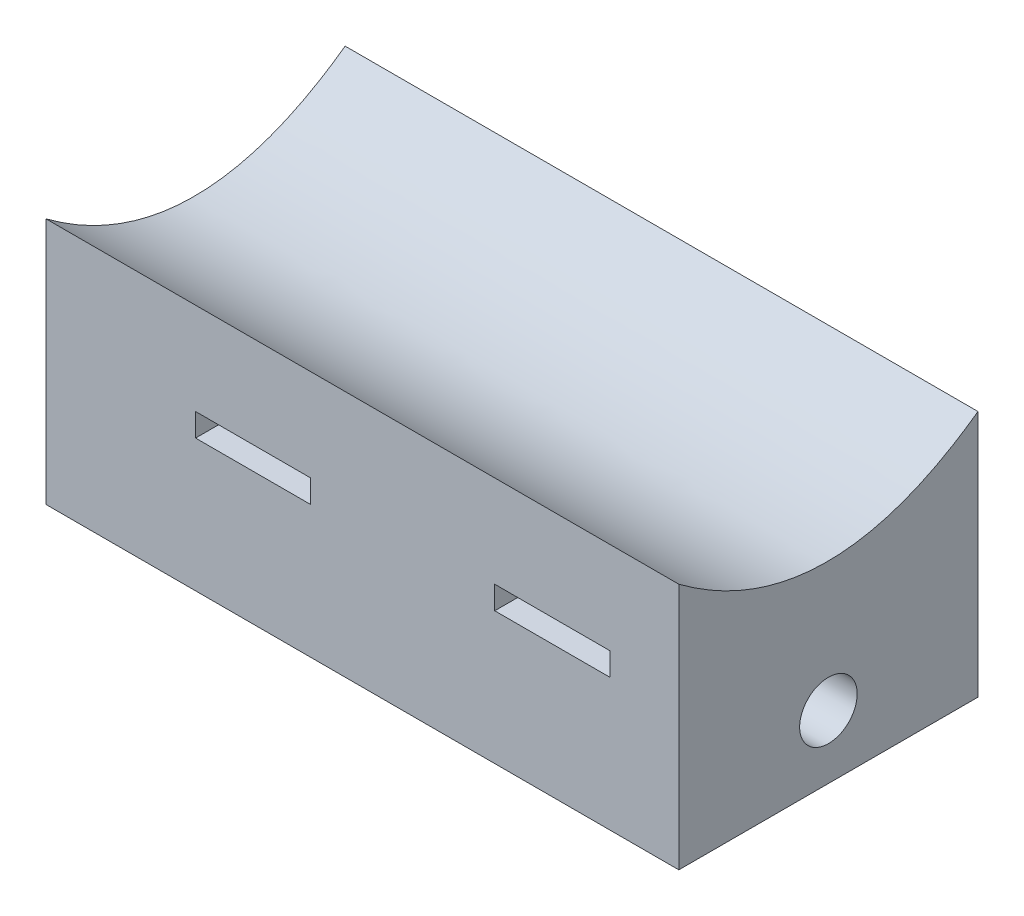
ISO-10303-21;
HEADER;
FILE_DESCRIPTION(('STEP AP214'),'2;1');
FILE_NAME('part.step','',(''),(''),'','','');
FILE_SCHEMA(('AUTOMOTIVE_DESIGN { 1 0 10303 214 1 1 1 1 }'));
ENDSEC;
DATA;
#1=APPLICATION_CONTEXT('core data for automotive mechanical design processes');
#2=APPLICATION_PROTOCOL_DEFINITION('international standard','automotive_design',2000,#1);
#3=PRODUCT_CONTEXT('',#1,'mechanical');
#4=PRODUCT('Part','Part','',(#3));
#5=PRODUCT_RELATED_PRODUCT_CATEGORY('part','',(#4));
#6=PRODUCT_DEFINITION_FORMATION('','',#4);
#7=PRODUCT_DEFINITION_CONTEXT('part definition',#1,'design');
#8=PRODUCT_DEFINITION('design','',#6,#7);
#9=PRODUCT_DEFINITION_SHAPE('','',#8);
#10=(LENGTH_UNIT() NAMED_UNIT(*) SI_UNIT(.MILLI.,.METRE.));
#11=(NAMED_UNIT(*) PLANE_ANGLE_UNIT() SI_UNIT($,.RADIAN.));
#12=(NAMED_UNIT(*) SI_UNIT($,.STERADIAN.) SOLID_ANGLE_UNIT());
#13=UNCERTAINTY_MEASURE_WITH_UNIT(LENGTH_MEASURE(1.E-05),#10,'distance_accuracy_value','');
#14=(GEOMETRIC_REPRESENTATION_CONTEXT(3) GLOBAL_UNCERTAINTY_ASSIGNED_CONTEXT((#13)) GLOBAL_UNIT_ASSIGNED_CONTEXT((#10,
#11,#12)) REPRESENTATION_CONTEXT('',''));
#15=CARTESIAN_POINT('',(0.,0.,0.));
#16=DIRECTION('',(0.,0.,1.));
#17=DIRECTION('',(1.,0.,0.));
#18=AXIS2_PLACEMENT_3D('',#15,#16,#17);
#19=CARTESIAN_POINT('',(-24.8566610455312,25.,-8.64881956155143));
#20=DIRECTION('',(1.,0.,0.));
#21=DIRECTION('',(0.,0.,-1.));
#22=AXIS2_PLACEMENT_3D('',#19,#20,#21);
#23=PLANE('',#22);
#24=CARTESIAN_POINT('',(-24.8566610455312,9.,4.35118043844857));
#25=DIRECTION('',(1.,0.,0.));
#26=DIRECTION('',(0.,0.,-1.));
#27=AXIS2_PLACEMENT_3D('',#24,#25,#26);
#28=CIRCLE('',#27,2.5);
#29=CARTESIAN_POINT('',(-24.8566610455312,9.,1.85118043844857));
#30=VERTEX_POINT('',#29);
#31=EDGE_CURVE('E184',#30,#30,#28,.F.);
#32=ORIENTED_EDGE('',*,*,#31,.F.);
#33=EDGE_LOOP('',(#32));
#34=FACE_BOUND('',#33,.T.);
#35=DIRECTION('',(0.,-1.,0.));
#36=VECTOR('',#35,1.);
#37=CARTESIAN_POINT('',(-24.8566610455312,25.,17.3511804384486));
#38=LINE('',#37,#36);
#39=CARTESIAN_POINT('',(-24.8566610455312,25.,17.3511804384486));
#40=VERTEX_POINT('',#39);
#41=CARTESIAN_POINT('',(-24.8566610455312,3.5,17.3511804384486));
#42=VERTEX_POINT('',#41);
#43=EDGE_CURVE('E11',#40,#42,#38,.T.);
#44=ORIENTED_EDGE('',*,*,#43,.F.);
#45=CARTESIAN_POINT('',(-24.8566610455312,25.,17.3511804384486));
#46=CARTESIAN_POINT('',(-24.8566610455312,15.5026438838877,4.58688351149129));
#47=CARTESIAN_POINT('',(-24.8566610455312,25.,-8.64881956155143));
#48=B_SPLINE_CURVE_WITH_KNOTS('',2,(#45,#46,#47),.UNSPECIFIED.,.F.,.F.,(3,3),(0.,1.),.UNSPECIFIED.);
#49=CARTESIAN_POINT('',(-24.8566610455312,25.,-8.64881956155143));
#50=VERTEX_POINT('',#49);
#51=EDGE_CURVE('E124',#50,#40,#48,.F.);
#52=ORIENTED_EDGE('',*,*,#51,.F.);
#53=DIRECTION('',(0.,-1.,0.));
#54=VECTOR('',#53,1.);
#55=CARTESIAN_POINT('',(-24.8566610455312,25.,-8.64881956155143));
#56=LINE('',#55,#54);
#57=CARTESIAN_POINT('',(-24.8566610455312,3.5,-8.64881956155143));
#58=VERTEX_POINT('',#57);
#59=EDGE_CURVE('E132',#50,#58,#56,.T.);
#60=ORIENTED_EDGE('',*,*,#59,.T.);
#61=DIRECTION('',(0.,0.,-1.));
#62=VECTOR('',#61,1.);
#63=CARTESIAN_POINT('',(-24.8566610455312,3.5,17.3511804384486));
#64=LINE('',#63,#62);
#65=EDGE_CURVE('E48',#42,#58,#64,.T.);
#66=ORIENTED_EDGE('',*,*,#65,.F.);
#67=EDGE_LOOP('',(#44,#52,#60,#66));
#68=FACE_BOUND('',#67,.T.);
#69=ADVANCED_FACE('F33',(#34,#68),#23,.F.);
#70=CARTESIAN_POINT('',(-24.8566610455312,25.,17.3511804384486));
#71=DIRECTION('',(0.,0.,-1.));
#72=DIRECTION('',(-1.,0.,0.));
#73=AXIS2_PLACEMENT_3D('',#70,#71,#72);
#74=PLANE('',#73);
#75=DIRECTION('',(0.,-1.,0.));
#76=VECTOR('',#75,1.);
#77=CARTESIAN_POINT('',(-11.8566610455312,17.,17.3511804384486));
#78=LINE('',#77,#76);
#79=CARTESIAN_POINT('',(-11.8566610455312,17.,17.3511804384486));
#80=VERTEX_POINT('',#79);
#81=CARTESIAN_POINT('',(-11.8566610455312,15.,17.3511804384486));
#82=VERTEX_POINT('',#81);
#83=EDGE_CURVE('E196',#80,#82,#78,.T.);
#84=ORIENTED_EDGE('',*,*,#83,.F.);
#85=DIRECTION('',(-1.,0.,0.));
#86=VECTOR('',#85,1.);
#87=CARTESIAN_POINT('',(-1.8566610455312,17.,17.3511804384486));
#88=LINE('',#87,#86);
#89=CARTESIAN_POINT('',(-1.8566610455312,17.,17.3511804384486));
#90=VERTEX_POINT('',#89);
#91=EDGE_CURVE('E56',#90,#80,#88,.T.);
#92=ORIENTED_EDGE('',*,*,#91,.F.);
#93=DIRECTION('',(0.,1.,0.));
#94=VECTOR('',#93,1.);
#95=CARTESIAN_POINT('',(-1.8566610455312,17.,17.3511804384486));
#96=LINE('',#95,#94);
#97=CARTESIAN_POINT('',(-1.8566610455312,15.,17.3511804384486));
#98=VERTEX_POINT('',#97);
#99=EDGE_CURVE('E202',#98,#90,#96,.T.);
#100=ORIENTED_EDGE('',*,*,#99,.F.);
#101=DIRECTION('',(1.,0.,0.));
#102=VECTOR('',#101,1.);
#103=CARTESIAN_POINT('',(-1.8566610455312,15.,17.3511804384486));
#104=LINE('',#103,#102);
#105=EDGE_CURVE('E199',#82,#98,#104,.T.);
#106=ORIENTED_EDGE('',*,*,#105,.F.);
#107=EDGE_LOOP('',(#84,#92,#100,#106));
#108=FACE_BOUND('',#107,.T.);
#109=DIRECTION('',(1.,0.,0.));
#110=VECTOR('',#109,1.);
#111=CARTESIAN_POINT('',(14.1433389544688,15.,17.3511804384486));
#112=LINE('',#111,#110);
#113=CARTESIAN_POINT('',(14.1433389544688,15.,17.3511804384486));
#114=VERTEX_POINT('',#113);
#115=CARTESIAN_POINT('',(24.1433389544688,15.,17.3511804384486));
#116=VERTEX_POINT('',#115);
#117=EDGE_CURVE('E226',#114,#116,#112,.T.);
#118=ORIENTED_EDGE('',*,*,#117,.F.);
#119=DIRECTION('',(0.,-1.,0.));
#120=VECTOR('',#119,1.);
#121=CARTESIAN_POINT('',(14.1433389544688,17.,17.3511804384486));
#122=LINE('',#121,#120);
#123=CARTESIAN_POINT('',(14.1433389544688,17.,17.3511804384486));
#124=VERTEX_POINT('',#123);
#125=EDGE_CURVE('E224',#124,#114,#122,.T.);
#126=ORIENTED_EDGE('',*,*,#125,.F.);
#127=DIRECTION('',(-1.,0.,0.));
#128=VECTOR('',#127,1.);
#129=CARTESIAN_POINT('',(14.1433389544688,17.,17.3511804384486));
#130=LINE('',#129,#128);
#131=CARTESIAN_POINT('',(24.1433389544688,17.,17.3511804384486));
#132=VERTEX_POINT('',#131);
#133=EDGE_CURVE('E232',#132,#124,#130,.T.);
#134=ORIENTED_EDGE('',*,*,#133,.F.);
#135=DIRECTION('',(0.,1.,0.));
#136=VECTOR('',#135,1.);
#137=CARTESIAN_POINT('',(24.1433389544688,17.,17.3511804384486));
#138=LINE('',#137,#136);
#139=EDGE_CURVE('E229',#116,#132,#138,.T.);
#140=ORIENTED_EDGE('',*,*,#139,.F.);
#141=EDGE_LOOP('',(#118,#126,#134,#140));
#142=FACE_BOUND('',#141,.T.);
#143=ORIENTED_EDGE('',*,*,#43,.T.);
#144=DIRECTION('',(1.,0.,0.));
#145=VECTOR('',#144,1.);
#146=CARTESIAN_POINT('',(-24.8576610455312,3.5,17.3511804384486));
#147=LINE('',#146,#145);
#148=CARTESIAN_POINT('',(30.1433389544688,3.5,17.3511804384486));
#149=VERTEX_POINT('',#148);
#150=EDGE_CURVE('E138',#42,#149,#147,.T.);
#151=ORIENTED_EDGE('',*,*,#150,.T.);
#152=DIRECTION('',(0.,-1.,0.));
#153=VECTOR('',#152,1.);
#154=CARTESIAN_POINT('',(30.1433389544688,25.,17.3511804384486));
#155=LINE('',#154,#153);
#156=CARTESIAN_POINT('',(30.1433389544688,25.,17.3511804384486));
#157=VERTEX_POINT('',#156);
#158=EDGE_CURVE('E41',#157,#149,#155,.T.);
#159=ORIENTED_EDGE('',*,*,#158,.F.);
#160=DIRECTION('',(1.,0.,0.));
#161=VECTOR('',#160,1.);
#162=CARTESIAN_POINT('',(-24.8566610455312,25.,17.3511804384486));
#163=LINE('',#162,#161);
#164=EDGE_CURVE('E133',#40,#157,#163,.T.);
#165=ORIENTED_EDGE('',*,*,#164,.F.);
#166=EDGE_LOOP('',(#143,#151,#159,#165));
#167=FACE_BOUND('',#166,.T.);
#168=ADVANCED_FACE('F175',(#108,#142,#167),#74,.F.);
#169=CARTESIAN_POINT('',(30.1433389544688,25.,-8.64881956155143));
#170=DIRECTION('',(-1.,0.,0.));
#171=DIRECTION('',(0.,0.,1.));
#172=AXIS2_PLACEMENT_3D('',#169,#170,#171);
#173=PLANE('',#172);
#174=CARTESIAN_POINT('',(30.1433389544688,9.,4.35118043844857));
#175=DIRECTION('',(1.,0.,0.));
#176=DIRECTION('',(0.,0.,-1.));
#177=AXIS2_PLACEMENT_3D('',#174,#175,#176);
#178=CIRCLE('',#177,2.5);
#179=CARTESIAN_POINT('',(30.1433389544688,9.,1.85118043844856));
#180=VERTEX_POINT('',#179);
#181=EDGE_CURVE('E181',#180,#180,#178,.T.);
#182=ORIENTED_EDGE('',*,*,#181,.F.);
#183=EDGE_LOOP('',(#182));
#184=FACE_BOUND('',#183,.T.);
#185=DIRECTION('',(0.,-1.,0.));
#186=VECTOR('',#185,1.);
#187=CARTESIAN_POINT('',(30.1433389544688,25.,-8.64881956155143));
#188=LINE('',#187,#186);
#189=CARTESIAN_POINT('',(30.1433389544688,25.,-8.64881956155143));
#190=VERTEX_POINT('',#189);
#191=CARTESIAN_POINT('',(30.1433389544688,3.5,-8.64881956155143));
#192=VERTEX_POINT('',#191);
#193=EDGE_CURVE('E142',#190,#192,#188,.T.);
#194=ORIENTED_EDGE('',*,*,#193,.F.);
#195=CARTESIAN_POINT('',(30.1433389544688,25.,17.3511804384486));
#196=CARTESIAN_POINT('',(30.1433389544688,15.5026438838877,4.58688351149128));
#197=CARTESIAN_POINT('',(30.1433389544688,25.,-8.64881956155143));
#198=B_SPLINE_CURVE_WITH_KNOTS('',2,(#195,#196,#197),.UNSPECIFIED.,.F.,.F.,(3,3),(0.,1.),.UNSPECIFIED.);
#199=EDGE_CURVE('E127',#157,#190,#198,.T.);
#200=ORIENTED_EDGE('',*,*,#199,.F.);
#201=ORIENTED_EDGE('',*,*,#158,.T.);
#202=DIRECTION('',(0.,0.,1.));
#203=VECTOR('',#202,1.);
#204=CARTESIAN_POINT('',(30.1433389544688,3.5,17.3511804384486));
#205=LINE('',#204,#203);
#206=EDGE_CURVE('E172',#192,#149,#205,.T.);
#207=ORIENTED_EDGE('',*,*,#206,.F.);
#208=EDGE_LOOP('',(#194,#200,#201,#207));
#209=FACE_BOUND('',#208,.T.);
#210=ADVANCED_FACE('F171',(#184,#209),#173,.F.);
#211=CARTESIAN_POINT('',(-24.8566610455312,25.,-8.64881956155143));
#212=DIRECTION('',(0.,0.,1.));
#213=DIRECTION('',(1.,0.,0.));
#214=AXIS2_PLACEMENT_3D('',#211,#212,#213);
#215=PLANE('',#214);
#216=DIRECTION('',(0.,-1.,0.));
#217=VECTOR('',#216,1.);
#218=CARTESIAN_POINT('',(-1.8566610455312,17.,-8.64881956155143));
#219=LINE('',#218,#217);
#220=CARTESIAN_POINT('',(-1.8566610455312,17.,-8.64881956155143));
#221=VERTEX_POINT('',#220);
#222=CARTESIAN_POINT('',(-1.8566610455312,15.,-8.64881956155143));
#223=VERTEX_POINT('',#222);
#224=EDGE_CURVE('E189',#221,#223,#219,.T.);
#225=ORIENTED_EDGE('',*,*,#224,.F.);
#226=DIRECTION('',(1.,0.,0.));
#227=VECTOR('',#226,1.);
#228=CARTESIAN_POINT('',(-1.8566610455312,17.,-8.64881956155143));
#229=LINE('',#228,#227);
#230=CARTESIAN_POINT('',(-11.8566610455312,17.,-8.64881956155143));
#231=VERTEX_POINT('',#230);
#232=EDGE_CURVE('E192',#231,#221,#229,.T.);
#233=ORIENTED_EDGE('',*,*,#232,.F.);
#234=DIRECTION('',(0.,1.,0.));
#235=VECTOR('',#234,1.);
#236=CARTESIAN_POINT('',(-11.8566610455312,17.,-8.64881956155143));
#237=LINE('',#236,#235);
#238=CARTESIAN_POINT('',(-11.8566610455312,15.,-8.64881956155143));
#239=VERTEX_POINT('',#238);
#240=EDGE_CURVE('E208',#239,#231,#237,.T.);
#241=ORIENTED_EDGE('',*,*,#240,.F.);
#242=DIRECTION('',(-1.,0.,0.));
#243=VECTOR('',#242,1.);
#244=CARTESIAN_POINT('',(-1.8566610455312,15.,-8.64881956155143));
#245=LINE('',#244,#243);
#246=EDGE_CURVE('E187',#223,#239,#245,.T.);
#247=ORIENTED_EDGE('',*,*,#246,.F.);
#248=EDGE_LOOP('',(#225,#233,#241,#247));
#249=FACE_BOUND('',#248,.T.);
#250=DIRECTION('',(1.,0.,0.));
#251=VECTOR('',#250,1.);
#252=CARTESIAN_POINT('',(14.1433389544688,17.,-8.64881956155143));
#253=LINE('',#252,#251);
#254=CARTESIAN_POINT('',(14.1433389544688,17.,-8.64881956155143));
#255=VERTEX_POINT('',#254);
#256=CARTESIAN_POINT('',(24.1433389544688,17.,-8.64881956155143));
#257=VERTEX_POINT('',#256);
#258=EDGE_CURVE('E218',#255,#257,#253,.T.);
#259=ORIENTED_EDGE('',*,*,#258,.F.);
#260=DIRECTION('',(0.,1.,0.));
#261=VECTOR('',#260,1.);
#262=CARTESIAN_POINT('',(14.1433389544688,17.,-8.64881956155143));
#263=LINE('',#262,#261);
#264=CARTESIAN_POINT('',(14.1433389544688,15.,-8.64881956155143));
#265=VERTEX_POINT('',#264);
#266=EDGE_CURVE('E221',#265,#255,#263,.T.);
#267=ORIENTED_EDGE('',*,*,#266,.F.);
#268=DIRECTION('',(-1.,0.,0.));
#269=VECTOR('',#268,1.);
#270=CARTESIAN_POINT('',(14.1433389544688,15.,-8.64881956155143));
#271=LINE('',#270,#269);
#272=CARTESIAN_POINT('',(24.1433389544688,15.,-8.64881956155143));
#273=VERTEX_POINT('',#272);
#274=EDGE_CURVE('E151',#273,#265,#271,.T.);
#275=ORIENTED_EDGE('',*,*,#274,.F.);
#276=DIRECTION('',(0.,-1.,0.));
#277=VECTOR('',#276,1.);
#278=CARTESIAN_POINT('',(24.1433389544688,17.,-8.64881956155143));
#279=LINE('',#278,#277);
#280=EDGE_CURVE('E216',#257,#273,#279,.T.);
#281=ORIENTED_EDGE('',*,*,#280,.F.);
#282=EDGE_LOOP('',(#259,#267,#275,#281));
#283=FACE_BOUND('',#282,.T.);
#284=ORIENTED_EDGE('',*,*,#193,.T.);
#285=DIRECTION('',(1.,0.,0.));
#286=VECTOR('',#285,1.);
#287=CARTESIAN_POINT('',(-24.8576610455312,3.5,-8.64881956155142));
#288=LINE('',#287,#286);
#289=EDGE_CURVE('E141',#58,#192,#288,.T.);
#290=ORIENTED_EDGE('',*,*,#289,.F.);
#291=ORIENTED_EDGE('',*,*,#59,.F.);
#292=DIRECTION('',(-1.,0.,0.));
#293=VECTOR('',#292,1.);
#294=CARTESIAN_POINT('',(-24.8566610455312,25.,-8.64881956155143));
#295=LINE('',#294,#293);
#296=EDGE_CURVE('E121',#190,#50,#295,.T.);
#297=ORIENTED_EDGE('',*,*,#296,.F.);
#298=EDGE_LOOP('',(#284,#290,#291,#297));
#299=FACE_BOUND('',#298,.T.);
#300=ADVANCED_FACE('F140',(#249,#283,#299),#215,.F.);
#301=CARTESIAN_POINT('',(14.1433389544688,17.,-8.64981956155143));
#302=DIRECTION('',(-1.,0.,0.));
#303=DIRECTION('',(0.,-1.,0.));
#304=AXIS2_PLACEMENT_3D('',#301,#302,#303);
#305=PLANE('',#304);
#306=ORIENTED_EDGE('',*,*,#266,.T.);
#307=DIRECTION('',(0.,0.,1.));
#308=VECTOR('',#307,1.);
#309=CARTESIAN_POINT('',(14.1433389544688,17.,-8.64981956155143));
#310=LINE('',#309,#308);
#311=EDGE_CURVE('E154',#255,#124,#310,.T.);
#312=ORIENTED_EDGE('',*,*,#311,.T.);
#313=ORIENTED_EDGE('',*,*,#125,.T.);
#314=DIRECTION('',(0.,0.,1.));
#315=VECTOR('',#314,1.);
#316=CARTESIAN_POINT('',(14.1433389544688,15.,-8.64981956155143));
#317=LINE('',#316,#315);
#318=EDGE_CURVE('E164',#265,#114,#317,.T.);
#319=ORIENTED_EDGE('',*,*,#318,.F.);
#320=EDGE_LOOP('',(#306,#312,#313,#319));
#321=FACE_BOUND('',#320,.T.);
#322=ADVANCED_FACE('F250',(#321),#305,.F.);
#323=CARTESIAN_POINT('',(14.1433389544688,17.,-8.64981956155143));
#324=DIRECTION('',(0.,1.,0.));
#325=DIRECTION('',(0.,0.,1.));
#326=AXIS2_PLACEMENT_3D('',#323,#324,#325);
#327=PLANE('',#326);
#328=ORIENTED_EDGE('',*,*,#258,.T.);
#329=DIRECTION('',(0.,0.,1.));
#330=VECTOR('',#329,1.);
#331=CARTESIAN_POINT('',(24.1433389544688,17.,-8.64981956155143));
#332=LINE('',#331,#330);
#333=EDGE_CURVE('E161',#257,#132,#332,.T.);
#334=ORIENTED_EDGE('',*,*,#333,.T.);
#335=ORIENTED_EDGE('',*,*,#133,.T.);
#336=ORIENTED_EDGE('',*,*,#311,.F.);
#337=EDGE_LOOP('',(#328,#334,#335,#336));
#338=FACE_BOUND('',#337,.T.);
#339=ADVANCED_FACE('F248',(#338),#327,.F.);
#340=CARTESIAN_POINT('',(24.1433389544688,17.,-8.64981956155143));
#341=DIRECTION('',(1.,0.,0.));
#342=DIRECTION('',(0.,0.,-1.));
#343=AXIS2_PLACEMENT_3D('',#340,#341,#342);
#344=PLANE('',#343);
#345=ORIENTED_EDGE('',*,*,#280,.T.);
#346=DIRECTION('',(0.,0.,1.));
#347=VECTOR('',#346,1.);
#348=CARTESIAN_POINT('',(24.1433389544688,15.,-8.64981956155143));
#349=LINE('',#348,#347);
#350=EDGE_CURVE('E235',#273,#116,#349,.T.);
#351=ORIENTED_EDGE('',*,*,#350,.T.);
#352=ORIENTED_EDGE('',*,*,#139,.T.);
#353=ORIENTED_EDGE('',*,*,#333,.F.);
#354=EDGE_LOOP('',(#345,#351,#352,#353));
#355=FACE_BOUND('',#354,.T.);
#356=ADVANCED_FACE('F244',(#355),#344,.F.);
#357=CARTESIAN_POINT('',(14.1433389544688,15.,-8.64981956155143));
#358=DIRECTION('',(0.,-1.,0.));
#359=DIRECTION('',(1.,0.,0.));
#360=AXIS2_PLACEMENT_3D('',#357,#358,#359);
#361=PLANE('',#360);
#362=ORIENTED_EDGE('',*,*,#274,.T.);
#363=ORIENTED_EDGE('',*,*,#318,.T.);
#364=ORIENTED_EDGE('',*,*,#117,.T.);
#365=ORIENTED_EDGE('',*,*,#350,.F.);
#366=EDGE_LOOP('',(#362,#363,#364,#365));
#367=FACE_BOUND('',#366,.T.);
#368=ADVANCED_FACE('F238',(#367),#361,.F.);
#369=CARTESIAN_POINT('',(-1.8566610455312,17.,-8.64981956155143));
#370=DIRECTION('',(0.,1.,0.));
#371=DIRECTION('',(0.,0.,1.));
#372=AXIS2_PLACEMENT_3D('',#369,#370,#371);
#373=PLANE('',#372);
#374=ORIENTED_EDGE('',*,*,#232,.T.);
#375=DIRECTION('',(0.,0.,1.));
#376=VECTOR('',#375,1.);
#377=CARTESIAN_POINT('',(-1.8566610455312,17.,-8.64981956155143));
#378=LINE('',#377,#376);
#379=EDGE_CURVE('E206',#221,#90,#378,.T.);
#380=ORIENTED_EDGE('',*,*,#379,.T.);
#381=ORIENTED_EDGE('',*,*,#91,.T.);
#382=DIRECTION('',(0.,0.,1.));
#383=VECTOR('',#382,1.);
#384=CARTESIAN_POINT('',(-11.8566610455312,17.,-8.64981956155143));
#385=LINE('',#384,#383);
#386=EDGE_CURVE('E205',#231,#80,#385,.T.);
#387=ORIENTED_EDGE('',*,*,#386,.F.);
#388=EDGE_LOOP('',(#374,#380,#381,#387));
#389=FACE_BOUND('',#388,.T.);
#390=ADVANCED_FACE('F288',(#389),#373,.F.);
#391=CARTESIAN_POINT('',(-1.8566610455312,17.,-8.64981956155143));
#392=DIRECTION('',(1.,0.,0.));
#393=DIRECTION('',(0.,1.,0.));
#394=AXIS2_PLACEMENT_3D('',#391,#392,#393);
#395=PLANE('',#394);
#396=ORIENTED_EDGE('',*,*,#224,.T.);
#397=DIRECTION('',(0.,0.,1.));
#398=VECTOR('',#397,1.);
#399=CARTESIAN_POINT('',(-1.8566610455312,15.,-8.64981956155143));
#400=LINE('',#399,#398);
#401=EDGE_CURVE('E209',#223,#98,#400,.T.);
#402=ORIENTED_EDGE('',*,*,#401,.T.);
#403=ORIENTED_EDGE('',*,*,#99,.T.);
#404=ORIENTED_EDGE('',*,*,#379,.F.);
#405=EDGE_LOOP('',(#396,#402,#403,#404));
#406=FACE_BOUND('',#405,.T.);
#407=ADVANCED_FACE('F285',(#406),#395,.F.);
#408=CARTESIAN_POINT('',(-1.8566610455312,15.,-8.64981956155143));
#409=DIRECTION('',(0.,-1.,0.));
#410=DIRECTION('',(1.,0.,0.));
#411=AXIS2_PLACEMENT_3D('',#408,#409,#410);
#412=PLANE('',#411);
#413=ORIENTED_EDGE('',*,*,#246,.T.);
#414=DIRECTION('',(0.,0.,1.));
#415=VECTOR('',#414,1.);
#416=CARTESIAN_POINT('',(-11.8566610455312,15.,-8.64981956155143));
#417=LINE('',#416,#415);
#418=EDGE_CURVE('E211',#239,#82,#417,.T.);
#419=ORIENTED_EDGE('',*,*,#418,.T.);
#420=ORIENTED_EDGE('',*,*,#105,.T.);
#421=ORIENTED_EDGE('',*,*,#401,.F.);
#422=EDGE_LOOP('',(#413,#419,#420,#421));
#423=FACE_BOUND('',#422,.T.);
#424=ADVANCED_FACE('F280',(#423),#412,.F.);
#425=CARTESIAN_POINT('',(-11.8566610455312,17.,-8.64981956155143));
#426=DIRECTION('',(-1.,0.,0.));
#427=DIRECTION('',(0.,0.,1.));
#428=AXIS2_PLACEMENT_3D('',#425,#426,#427);
#429=PLANE('',#428);
#430=ORIENTED_EDGE('',*,*,#240,.T.);
#431=ORIENTED_EDGE('',*,*,#386,.T.);
#432=ORIENTED_EDGE('',*,*,#83,.T.);
#433=ORIENTED_EDGE('',*,*,#418,.F.);
#434=EDGE_LOOP('',(#430,#431,#432,#433));
#435=FACE_BOUND('',#434,.T.);
#436=ADVANCED_FACE('F271',(#435),#429,.F.);
#437=CARTESIAN_POINT('',(-24.8576610455312,9.,4.35118043844857));
#438=DIRECTION('',(1.,0.,0.));
#439=DIRECTION('',(0.,0.,-1.));
#440=AXIS2_PLACEMENT_3D('',#437,#438,#439);
#441=CYLINDRICAL_SURFACE('',#440,2.5);
#442=ORIENTED_EDGE('',*,*,#181,.T.);
#443=EDGE_LOOP('',(#442));
#444=FACE_BOUND('',#443,.T.);
#445=ORIENTED_EDGE('',*,*,#31,.T.);
#446=EDGE_LOOP('',(#445));
#447=FACE_BOUND('',#446,.T.);
#448=ADVANCED_FACE('F269',(#444,#447),#441,.F.);
#449=CARTESIAN_POINT('',(-24.8576610455312,25.,17.3511804384486));
#450=CARTESIAN_POINT('',(-24.8576610455312,15.5026438838877,4.58688351149129));
#451=CARTESIAN_POINT('',(-24.8576610455312,25.,-8.64881956155143));
#452=B_SPLINE_CURVE_WITH_KNOTS('',2,(#449,#450,#451),.UNSPECIFIED.,.F.,.F.,(3,3),(0.,1.),.UNSPECIFIED.);
#453=DIRECTION('',(1.,0.,0.));
#454=VECTOR('',#453,1.);
#455=SURFACE_OF_LINEAR_EXTRUSION('',#452,#454);
#456=ORIENTED_EDGE('',*,*,#51,.T.);
#457=ORIENTED_EDGE('',*,*,#164,.T.);
#458=ORIENTED_EDGE('',*,*,#199,.T.);
#459=ORIENTED_EDGE('',*,*,#296,.T.);
#460=EDGE_LOOP('',(#456,#457,#458,#459));
#461=FACE_BOUND('',#460,.T.);
#462=ADVANCED_FACE('F123',(#461),#455,.F.);
#463=CARTESIAN_POINT('',(-24.8576610455312,3.5,17.3511804384486));
#464=DIRECTION('',(0.,1.,0.));
#465=DIRECTION('',(0.,0.,1.));
#466=AXIS2_PLACEMENT_3D('',#463,#464,#465);
#467=PLANE('',#466);
#468=ORIENTED_EDGE('',*,*,#65,.T.);
#469=ORIENTED_EDGE('',*,*,#289,.T.);
#470=ORIENTED_EDGE('',*,*,#206,.T.);
#471=ORIENTED_EDGE('',*,*,#150,.F.);
#472=EDGE_LOOP('',(#468,#469,#470,#471));
#473=FACE_BOUND('',#472,.T.);
#474=ADVANCED_FACE('F278',(#473),#467,.F.);
#475=CLOSED_SHELL('',(#69,#168,#210,#300,#322,#339,#356,#368,#390,#407,#424,#436,#448,#462,#474));
#476=MANIFOLD_SOLID_BREP('B2',#475);
#477=ADVANCED_BREP_SHAPE_REPRESENTATION('',(#18,#476),#14);
#478=SHAPE_DEFINITION_REPRESENTATION(#9,#477);
ENDSEC;
END-ISO-10303-21;
